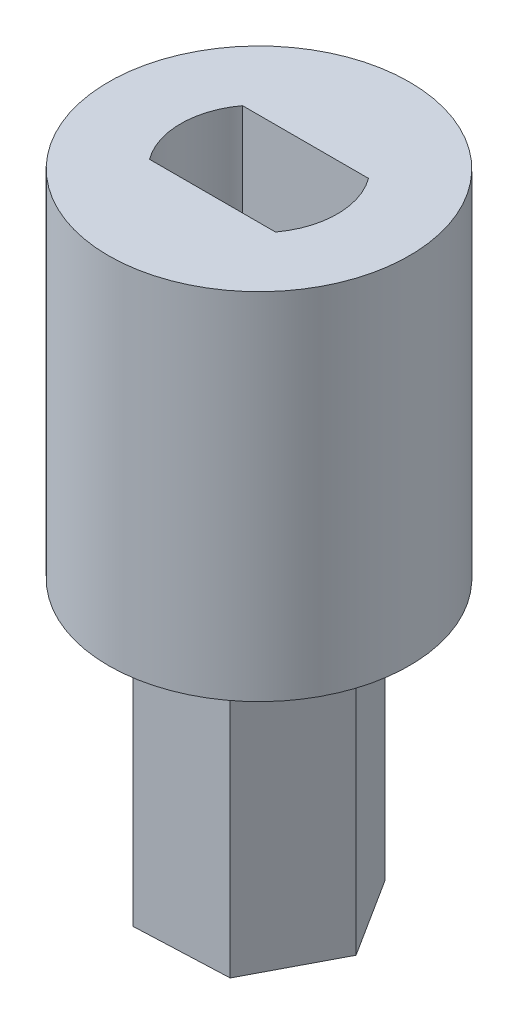
ISO-10303-21;
HEADER;
FILE_DESCRIPTION(('STEP AP214'),'2;1');
FILE_NAME('part.step','',(''),(''),'','','');
FILE_SCHEMA(('AUTOMOTIVE_DESIGN { 1 0 10303 214 1 1 1 1 }'));
ENDSEC;
DATA;
#1=APPLICATION_CONTEXT('core data for automotive mechanical design processes');
#2=APPLICATION_PROTOCOL_DEFINITION('international standard','automotive_design',2000,#1);
#3=PRODUCT_CONTEXT('',#1,'mechanical');
#4=PRODUCT('Part','Part','',(#3));
#5=PRODUCT_RELATED_PRODUCT_CATEGORY('part','',(#4));
#6=PRODUCT_DEFINITION_FORMATION('','',#4);
#7=PRODUCT_DEFINITION_CONTEXT('part definition',#1,'design');
#8=PRODUCT_DEFINITION('design','',#6,#7);
#9=PRODUCT_DEFINITION_SHAPE('','',#8);
#10=(LENGTH_UNIT() NAMED_UNIT(*) SI_UNIT(.MILLI.,.METRE.));
#11=(NAMED_UNIT(*) PLANE_ANGLE_UNIT() SI_UNIT($,.RADIAN.));
#12=(NAMED_UNIT(*) SI_UNIT($,.STERADIAN.) SOLID_ANGLE_UNIT());
#13=UNCERTAINTY_MEASURE_WITH_UNIT(LENGTH_MEASURE(1.E-05),#10,'distance_accuracy_value','');
#14=(GEOMETRIC_REPRESENTATION_CONTEXT(3) GLOBAL_UNCERTAINTY_ASSIGNED_CONTEXT((#13)) GLOBAL_UNIT_ASSIGNED_CONTEXT((#10,
#11,#12)) REPRESENTATION_CONTEXT('',''));
#15=CARTESIAN_POINT('',(0.,0.,0.));
#16=DIRECTION('',(0.,0.,1.));
#17=DIRECTION('',(1.,0.,0.));
#18=AXIS2_PLACEMENT_3D('',#15,#16,#17);
#19=CARTESIAN_POINT('',(-1.76590224374379,11.5,3.37662394493978));
#20=DIRECTION('',(-0.0417255681407558,0.,-0.999129109256322));
#21=DIRECTION('',(-0.999129109256322,0.,0.0417255681407559));
#22=AXIS2_PLACEMENT_3D('',#19,#20,#21);
#23=PLANE('',#22);
#24=DIRECTION('',(0.999129109256322,0.,-0.0417255681407559));
#25=VECTOR('',#24,1.);
#26=CARTESIAN_POINT('',(-1.76590224374379,0.,3.37662394493978));
#27=LINE('',#26,#25);
#28=CARTESIAN_POINT('',(-1.76590224374379,0.,3.37662394493978));
#29=VERTEX_POINT('',#28);
#30=CARTESIAN_POINT('',(2.04129099347278,0.,3.21762817615195));
#31=VERTEX_POINT('',#30);
#32=EDGE_CURVE('E151',#29,#31,#27,.T.);
#33=ORIENTED_EDGE('',*,*,#32,.T.);
#34=DIRECTION('',(0.,-1.,0.));
#35=VECTOR('',#34,1.);
#36=CARTESIAN_POINT('',(2.04129099347278,11.5,3.21762817615195));
#37=LINE('',#36,#35);
#38=CARTESIAN_POINT('',(2.04129099347278,11.5,3.21762817615195));
#39=VERTEX_POINT('',#38);
#40=EDGE_CURVE('E11',#39,#31,#37,.T.);
#41=ORIENTED_EDGE('',*,*,#40,.F.);
#42=DIRECTION('',(0.999129109256322,0.,-0.0417255681407559));
#43=VECTOR('',#42,1.);
#44=CARTESIAN_POINT('',(-1.76590224374379,11.5,3.37662394493978));
#45=LINE('',#44,#43);
#46=CARTESIAN_POINT('',(-1.76590224374379,11.5,3.37662394493978));
#47=VERTEX_POINT('',#46);
#48=EDGE_CURVE('E141',#47,#39,#45,.T.);
#49=ORIENTED_EDGE('',*,*,#48,.F.);
#50=DIRECTION('',(0.,-1.,0.));
#51=VECTOR('',#50,1.);
#52=CARTESIAN_POINT('',(-1.76590224374379,11.5,3.37662394493978));
#53=LINE('',#52,#51);
#54=EDGE_CURVE('E150',#47,#29,#53,.T.);
#55=ORIENTED_EDGE('',*,*,#54,.T.);
#56=EDGE_LOOP('',(#33,#41,#49,#55));
#57=FACE_BOUND('',#56,.T.);
#58=ADVANCED_FACE('F45',(#57),#23,.F.);
#59=CARTESIAN_POINT('',(2.04129099347278,11.5,3.21762817615195));
#60=DIRECTION('',(-0.88613397434687,0.,-0.463429152630928));
#61=DIRECTION('',(-0.463429152630928,0.,0.886133974346871));
#62=AXIS2_PLACEMENT_3D('',#59,#60,#61);
#63=PLANE('',#62);
#64=DIRECTION('',(0.463429152630928,0.,-0.886133974346871));
#65=VECTOR('',#64,1.);
#66=CARTESIAN_POINT('',(2.04129099347278,0.,3.21762817615195));
#67=LINE('',#66,#65);
#68=CARTESIAN_POINT('',(3.80719323721657,0.,-0.158995768787825));
#69=VERTEX_POINT('',#68);
#70=EDGE_CURVE('E155',#31,#69,#67,.T.);
#71=ORIENTED_EDGE('',*,*,#70,.T.);
#72=DIRECTION('',(0.,-1.,0.));
#73=VECTOR('',#72,1.);
#74=CARTESIAN_POINT('',(3.80719323721657,11.5,-0.158995768787825));
#75=LINE('',#74,#73);
#76=CARTESIAN_POINT('',(3.80719323721657,11.5,-0.158995768787825));
#77=VERTEX_POINT('',#76);
#78=EDGE_CURVE('E53',#77,#69,#75,.T.);
#79=ORIENTED_EDGE('',*,*,#78,.F.);
#80=DIRECTION('',(0.463429152630928,0.,-0.886133974346871));
#81=VECTOR('',#80,1.);
#82=CARTESIAN_POINT('',(2.04129099347278,11.5,3.21762817615195));
#83=LINE('',#82,#81);
#84=EDGE_CURVE('E104',#39,#77,#83,.T.);
#85=ORIENTED_EDGE('',*,*,#84,.F.);
#86=ORIENTED_EDGE('',*,*,#40,.T.);
#87=EDGE_LOOP('',(#71,#79,#85,#86));
#88=FACE_BOUND('',#87,.T.);
#89=ADVANCED_FACE('F288',(#88),#63,.F.);
#90=CARTESIAN_POINT('',(3.80719323721657,11.5,-0.158995768787825));
#91=DIRECTION('',(-0.844408406206115,0.,0.535699956625394));
#92=DIRECTION('',(0.535699956625394,0.,0.844408406206115));
#93=AXIS2_PLACEMENT_3D('',#90,#91,#92);
#94=PLANE('',#93);
#95=DIRECTION('',(-0.535699956625394,0.,-0.844408406206115));
#96=VECTOR('',#95,1.);
#97=CARTESIAN_POINT('',(3.80719323721657,0.,-0.158995768787825));
#98=LINE('',#97,#96);
#99=CARTESIAN_POINT('',(1.76590224374379,0.,-3.37662394493978));
#100=VERTEX_POINT('',#99);
#101=EDGE_CURVE('E120',#69,#100,#98,.T.);
#102=ORIENTED_EDGE('',*,*,#101,.T.);
#103=DIRECTION('',(0.,-1.,0.));
#104=VECTOR('',#103,1.);
#105=CARTESIAN_POINT('',(1.76590224374379,11.5,-3.37662394493978));
#106=LINE('',#105,#104);
#107=CARTESIAN_POINT('',(1.76590224374379,11.5,-3.37662394493978));
#108=VERTEX_POINT('',#107);
#109=EDGE_CURVE('E113',#108,#100,#106,.T.);
#110=ORIENTED_EDGE('',*,*,#109,.F.);
#111=DIRECTION('',(-0.535699956625394,0.,-0.844408406206115));
#112=VECTOR('',#111,1.);
#113=CARTESIAN_POINT('',(3.80719323721657,11.5,-0.158995768787825));
#114=LINE('',#113,#112);
#115=EDGE_CURVE('E118',#77,#108,#114,.T.);
#116=ORIENTED_EDGE('',*,*,#115,.F.);
#117=ORIENTED_EDGE('',*,*,#78,.T.);
#118=EDGE_LOOP('',(#102,#110,#116,#117));
#119=FACE_BOUND('',#118,.T.);
#120=ADVANCED_FACE('F115',(#119),#94,.F.);
#121=CARTESIAN_POINT('',(1.76590224374379,11.5,-3.37662394493978));
#122=DIRECTION('',(0.041725568140756,0.,0.999129109256322));
#123=DIRECTION('',(0.999129109256322,0.,-0.041725568140756));
#124=AXIS2_PLACEMENT_3D('',#121,#122,#123);
#125=PLANE('',#124);
#126=DIRECTION('',(-0.999129109256322,0.,0.041725568140756));
#127=VECTOR('',#126,1.);
#128=CARTESIAN_POINT('',(1.76590224374379,0.,-3.37662394493978));
#129=LINE('',#128,#127);
#130=CARTESIAN_POINT('',(-2.04129099347278,0.,-3.21762817615195));
#131=VERTEX_POINT('',#130);
#132=EDGE_CURVE('E161',#100,#131,#129,.T.);
#133=ORIENTED_EDGE('',*,*,#132,.T.);
#134=DIRECTION('',(0.,-1.,0.));
#135=VECTOR('',#134,1.);
#136=CARTESIAN_POINT('',(-2.04129099347278,11.5,-3.21762817615195));
#137=LINE('',#136,#135);
#138=CARTESIAN_POINT('',(-2.04129099347278,11.5,-3.21762817615195));
#139=VERTEX_POINT('',#138);
#140=EDGE_CURVE('E124',#139,#131,#137,.T.);
#141=ORIENTED_EDGE('',*,*,#140,.F.);
#142=DIRECTION('',(-0.999129109256322,0.,0.041725568140756));
#143=VECTOR('',#142,1.);
#144=CARTESIAN_POINT('',(1.76590224374379,11.5,-3.37662394493978));
#145=LINE('',#144,#143);
#146=EDGE_CURVE('E127',#108,#139,#145,.T.);
#147=ORIENTED_EDGE('',*,*,#146,.F.);
#148=ORIENTED_EDGE('',*,*,#109,.T.);
#149=EDGE_LOOP('',(#133,#141,#147,#148));
#150=FACE_BOUND('',#149,.T.);
#151=ADVANCED_FACE('F128',(#150),#125,.F.);
#152=CARTESIAN_POINT('',(-2.04129099347278,11.5,-3.21762817615195));
#153=DIRECTION('',(0.886133974346871,0.,0.463429152630927));
#154=DIRECTION('',(0.463429152630927,0.,-0.886133974346871));
#155=AXIS2_PLACEMENT_3D('',#152,#153,#154);
#156=PLANE('',#155);
#157=DIRECTION('',(-0.463429152630927,0.,0.886133974346871));
#158=VECTOR('',#157,1.);
#159=CARTESIAN_POINT('',(-2.04129099347278,0.,-3.21762817615195));
#160=LINE('',#159,#158);
#161=CARTESIAN_POINT('',(-3.80719323721657,0.,0.158995768787825));
#162=VERTEX_POINT('',#161);
#163=EDGE_CURVE('E164',#131,#162,#160,.T.);
#164=ORIENTED_EDGE('',*,*,#163,.T.);
#165=DIRECTION('',(0.,-1.,0.));
#166=VECTOR('',#165,1.);
#167=CARTESIAN_POINT('',(-3.80719323721657,11.5,0.158995768787825));
#168=LINE('',#167,#166);
#169=CARTESIAN_POINT('',(-3.80719323721657,11.5,0.158995768787825));
#170=VERTEX_POINT('',#169);
#171=EDGE_CURVE('E69',#170,#162,#168,.T.);
#172=ORIENTED_EDGE('',*,*,#171,.F.);
#173=DIRECTION('',(-0.463429152630927,0.,0.886133974346871));
#174=VECTOR('',#173,1.);
#175=CARTESIAN_POINT('',(-2.04129099347278,11.5,-3.21762817615195));
#176=LINE('',#175,#174);
#177=EDGE_CURVE('E133',#139,#170,#176,.T.);
#178=ORIENTED_EDGE('',*,*,#177,.F.);
#179=ORIENTED_EDGE('',*,*,#140,.T.);
#180=EDGE_LOOP('',(#164,#172,#178,#179));
#181=FACE_BOUND('',#180,.T.);
#182=ADVANCED_FACE('F179',(#181),#156,.F.);
#183=CARTESIAN_POINT('',(-3.80719323721657,11.5,0.158995768787825));
#184=DIRECTION('',(0.844408406206115,0.,-0.535699956625394));
#185=DIRECTION('',(-0.535699956625394,0.,-0.844408406206115));
#186=AXIS2_PLACEMENT_3D('',#183,#184,#185);
#187=PLANE('',#186);
#188=DIRECTION('',(0.535699956625394,0.,0.844408406206115));
#189=VECTOR('',#188,1.);
#190=CARTESIAN_POINT('',(-3.80719323721657,0.,0.158995768787825));
#191=LINE('',#190,#189);
#192=EDGE_CURVE('E96',#162,#29,#191,.T.);
#193=ORIENTED_EDGE('',*,*,#192,.T.);
#194=ORIENTED_EDGE('',*,*,#54,.F.);
#195=DIRECTION('',(0.535699956625394,0.,0.844408406206115));
#196=VECTOR('',#195,1.);
#197=CARTESIAN_POINT('',(-3.80719323721657,11.5,0.158995768787825));
#198=LINE('',#197,#196);
#199=EDGE_CURVE('E147',#170,#47,#198,.T.);
#200=ORIENTED_EDGE('',*,*,#199,.F.);
#201=ORIENTED_EDGE('',*,*,#171,.T.);
#202=EDGE_LOOP('',(#193,#194,#200,#201));
#203=FACE_BOUND('',#202,.T.);
#204=ADVANCED_FACE('F182',(#203),#187,.F.);
#205=CARTESIAN_POINT('',(0.,0.,0.));
#206=DIRECTION('',(0.,1.,0.));
#207=DIRECTION('',(0.,0.,1.));
#208=AXIS2_PLACEMENT_3D('',#205,#206,#207);
#209=PLANE('',#208);
#210=CARTESIAN_POINT('',(0.,0.,0.));
#211=DIRECTION('',(0.,-1.,0.));
#212=DIRECTION('',(0.,0.,-1.));
#213=AXIS2_PLACEMENT_3D('',#210,#211,#212);
#214=CIRCLE('',#213,1.25);
#215=CARTESIAN_POINT('',(0.,0.,-1.25));
#216=VERTEX_POINT('',#215);
#217=EDGE_CURVE('E194',#216,#216,#214,.T.);
#218=ORIENTED_EDGE('',*,*,#217,.F.);
#219=EDGE_LOOP('',(#218));
#220=FACE_BOUND('',#219,.T.);
#221=ORIENTED_EDGE('',*,*,#32,.F.);
#222=ORIENTED_EDGE('',*,*,#192,.F.);
#223=ORIENTED_EDGE('',*,*,#163,.F.);
#224=ORIENTED_EDGE('',*,*,#132,.F.);
#225=ORIENTED_EDGE('',*,*,#101,.F.);
#226=ORIENTED_EDGE('',*,*,#70,.F.);
#227=EDGE_LOOP('',(#221,#222,#223,#224,#225,#226));
#228=FACE_BOUND('',#227,.T.);
#229=ADVANCED_FACE('F177',(#220,#228),#209,.F.);
#230=CARTESIAN_POINT('',(0.,11.5,0.));
#231=DIRECTION('',(0.,1.,0.));
#232=DIRECTION('',(0.,0.,1.));
#233=AXIS2_PLACEMENT_3D('',#230,#231,#232);
#234=PLANE('',#233);
#235=CARTESIAN_POINT('',(0.,11.5,0.));
#236=DIRECTION('',(0.,1.,0.));
#237=DIRECTION('',(0.,0.,1.));
#238=AXIS2_PLACEMENT_3D('',#235,#236,#237);
#239=CIRCLE('',#238,6.15);
#240=CARTESIAN_POINT('',(0.,11.5,6.15));
#241=VERTEX_POINT('',#240);
#242=EDGE_CURVE('E186',#241,#241,#239,.T.);
#243=ORIENTED_EDGE('',*,*,#242,.F.);
#244=EDGE_LOOP('',(#243));
#245=FACE_BOUND('',#244,.T.);
#246=ORIENTED_EDGE('',*,*,#199,.T.);
#247=ORIENTED_EDGE('',*,*,#48,.T.);
#248=ORIENTED_EDGE('',*,*,#84,.T.);
#249=ORIENTED_EDGE('',*,*,#115,.T.);
#250=ORIENTED_EDGE('',*,*,#146,.T.);
#251=ORIENTED_EDGE('',*,*,#177,.T.);
#252=EDGE_LOOP('',(#246,#247,#248,#249,#250,#251));
#253=FACE_BOUND('',#252,.T.);
#254=ADVANCED_FACE('F136',(#245,#253),#234,.F.);
#255=CARTESIAN_POINT('',(0.,26.01,0.));
#256=DIRECTION('',(0.,-1.,0.));
#257=DIRECTION('',(0.,0.,-1.));
#258=AXIS2_PLACEMENT_3D('',#255,#256,#257);
#259=CYLINDRICAL_SURFACE('',#258,6.15);
#260=CARTESIAN_POINT('',(0.,26.01,0.));
#261=DIRECTION('',(0.,1.,0.));
#262=DIRECTION('',(0.,0.,1.));
#263=AXIS2_PLACEMENT_3D('',#260,#261,#262);
#264=CIRCLE('',#263,6.15);
#265=CARTESIAN_POINT('',(0.,26.01,6.15));
#266=VERTEX_POINT('',#265);
#267=EDGE_CURVE('E156',#266,#266,#264,.T.);
#268=ORIENTED_EDGE('',*,*,#267,.F.);
#269=EDGE_LOOP('',(#268));
#270=FACE_BOUND('',#269,.T.);
#271=ORIENTED_EDGE('',*,*,#242,.T.);
#272=EDGE_LOOP('',(#271));
#273=FACE_BOUND('',#272,.T.);
#274=ADVANCED_FACE('F306',(#270,#273),#259,.T.);
#275=CARTESIAN_POINT('',(0.,26.01,0.));
#276=DIRECTION('',(0.,1.,0.));
#277=DIRECTION('',(0.,0.,1.));
#278=AXIS2_PLACEMENT_3D('',#275,#276,#277);
#279=PLANE('',#278);
#280=CARTESIAN_POINT('',(0.,26.01,0.));
#281=DIRECTION('',(0.,1.,0.));
#282=DIRECTION('',(0.,0.,1.));
#283=AXIS2_PLACEMENT_3D('',#280,#281,#282);
#284=CIRCLE('',#283,3.2);
#285=CARTESIAN_POINT('',(2.57487863791675,26.01,1.9));
#286=VERTEX_POINT('',#285);
#287=CARTESIAN_POINT('',(2.57487863791675,26.01,-1.9));
#288=VERTEX_POINT('',#287);
#289=EDGE_CURVE('E60',#286,#288,#284,.T.);
#290=ORIENTED_EDGE('',*,*,#289,.F.);
#291=DIRECTION('',(1.,0.,0.));
#292=VECTOR('',#291,1.);
#293=CARTESIAN_POINT('',(-2.57487863791675,26.01,1.9));
#294=LINE('',#293,#292);
#295=CARTESIAN_POINT('',(-2.57487863791675,26.01,1.9));
#296=VERTEX_POINT('',#295);
#297=EDGE_CURVE('E216',#296,#286,#294,.T.);
#298=ORIENTED_EDGE('',*,*,#297,.F.);
#299=CARTESIAN_POINT('',(0.,26.01,0.));
#300=DIRECTION('',(0.,1.,0.));
#301=DIRECTION('',(0.,0.,1.));
#302=AXIS2_PLACEMENT_3D('',#299,#300,#301);
#303=CIRCLE('',#302,3.2);
#304=CARTESIAN_POINT('',(-2.57487863791675,26.01,-1.9));
#305=VERTEX_POINT('',#304);
#306=EDGE_CURVE('E221',#305,#296,#303,.T.);
#307=ORIENTED_EDGE('',*,*,#306,.F.);
#308=DIRECTION('',(-1.,0.,0.));
#309=VECTOR('',#308,1.);
#310=CARTESIAN_POINT('',(-2.57487863791675,26.01,-1.9));
#311=LINE('',#310,#309);
#312=EDGE_CURVE('E225',#288,#305,#311,.T.);
#313=ORIENTED_EDGE('',*,*,#312,.F.);
#314=EDGE_LOOP('',(#290,#298,#307,#313));
#315=FACE_BOUND('',#314,.T.);
#316=ORIENTED_EDGE('',*,*,#267,.T.);
#317=EDGE_LOOP('',(#316));
#318=FACE_BOUND('',#317,.T.);
#319=ADVANCED_FACE('F274',(#315,#318),#279,.T.);
#320=CARTESIAN_POINT('',(0.,8.,0.));
#321=DIRECTION('',(0.,-1.,0.));
#322=DIRECTION('',(0.,0.,-1.));
#323=AXIS2_PLACEMENT_3D('',#320,#321,#322);
#324=CYLINDRICAL_SURFACE('',#323,1.25);
#325=CARTESIAN_POINT('',(0.,8.,0.));
#326=DIRECTION('',(0.,-1.,0.));
#327=DIRECTION('',(0.,0.,-1.));
#328=AXIS2_PLACEMENT_3D('',#325,#326,#327);
#329=CIRCLE('',#328,1.25);
#330=CARTESIAN_POINT('',(0.,8.,-1.25));
#331=VERTEX_POINT('',#330);
#332=EDGE_CURVE('E190',#331,#331,#329,.T.);
#333=ORIENTED_EDGE('',*,*,#332,.F.);
#334=EDGE_LOOP('',(#333));
#335=FACE_BOUND('',#334,.T.);
#336=ORIENTED_EDGE('',*,*,#217,.T.);
#337=EDGE_LOOP('',(#336));
#338=FACE_BOUND('',#337,.T.);
#339=ADVANCED_FACE('F315',(#335,#338),#324,.F.);
#340=CARTESIAN_POINT('',(0.,8.,0.));
#341=DIRECTION('',(0.,-1.,0.));
#342=DIRECTION('',(0.,0.,-1.));
#343=AXIS2_PLACEMENT_3D('',#340,#341,#342);
#344=PLANE('',#343);
#345=ORIENTED_EDGE('',*,*,#332,.T.);
#346=EDGE_LOOP('',(#345));
#347=FACE_BOUND('',#346,.T.);
#348=ADVANCED_FACE('F318',(#347),#344,.T.);
#349=CARTESIAN_POINT('',(0.,18.01,0.));
#350=DIRECTION('',(0.,1.,0.));
#351=DIRECTION('',(0.,0.,1.));
#352=AXIS2_PLACEMENT_3D('',#349,#350,#351);
#353=CYLINDRICAL_SURFACE('',#352,3.2);
#354=ORIENTED_EDGE('',*,*,#289,.T.);
#355=DIRECTION('',(0.,1.,0.));
#356=VECTOR('',#355,1.);
#357=CARTESIAN_POINT('',(2.57487863791675,18.01,-1.9));
#358=LINE('',#357,#356);
#359=CARTESIAN_POINT('',(2.57487863791675,18.01,-1.9));
#360=VERTEX_POINT('',#359);
#361=EDGE_CURVE('E202',#360,#288,#358,.T.);
#362=ORIENTED_EDGE('',*,*,#361,.F.);
#363=CARTESIAN_POINT('',(0.,18.01,0.));
#364=DIRECTION('',(0.,1.,0.));
#365=DIRECTION('',(0.,0.,1.));
#366=AXIS2_PLACEMENT_3D('',#363,#364,#365);
#367=CIRCLE('',#366,3.2);
#368=CARTESIAN_POINT('',(2.57487863791675,18.01,1.9));
#369=VERTEX_POINT('',#368);
#370=EDGE_CURVE('E220',#369,#360,#367,.T.);
#371=ORIENTED_EDGE('',*,*,#370,.F.);
#372=DIRECTION('',(0.,1.,0.));
#373=VECTOR('',#372,1.);
#374=CARTESIAN_POINT('',(2.57487863791675,18.01,1.9));
#375=LINE('',#374,#373);
#376=EDGE_CURVE('E198',#369,#286,#375,.T.);
#377=ORIENTED_EDGE('',*,*,#376,.T.);
#378=EDGE_LOOP('',(#354,#362,#371,#377));
#379=FACE_BOUND('',#378,.T.);
#380=ADVANCED_FACE('F253',(#379),#353,.F.);
#381=CARTESIAN_POINT('',(-2.57487863791675,18.01,1.9));
#382=DIRECTION('',(0.,0.,1.));
#383=DIRECTION('',(1.,0.,0.));
#384=AXIS2_PLACEMENT_3D('',#381,#382,#383);
#385=PLANE('',#384);
#386=ORIENTED_EDGE('',*,*,#297,.T.);
#387=ORIENTED_EDGE('',*,*,#376,.F.);
#388=DIRECTION('',(1.,0.,0.));
#389=VECTOR('',#388,1.);
#390=CARTESIAN_POINT('',(-2.57487863791675,18.01,1.9));
#391=LINE('',#390,#389);
#392=CARTESIAN_POINT('',(-2.57487863791675,18.01,1.9));
#393=VERTEX_POINT('',#392);
#394=EDGE_CURVE('E206',#393,#369,#391,.T.);
#395=ORIENTED_EDGE('',*,*,#394,.F.);
#396=DIRECTION('',(0.,1.,0.));
#397=VECTOR('',#396,1.);
#398=CARTESIAN_POINT('',(-2.57487863791675,18.01,1.9));
#399=LINE('',#398,#397);
#400=EDGE_CURVE('E210',#393,#296,#399,.T.);
#401=ORIENTED_EDGE('',*,*,#400,.T.);
#402=EDGE_LOOP('',(#386,#387,#395,#401));
#403=FACE_BOUND('',#402,.T.);
#404=ADVANCED_FACE('F265',(#403),#385,.F.);
#405=CARTESIAN_POINT('',(0.,18.01,0.));
#406=DIRECTION('',(0.,1.,0.));
#407=DIRECTION('',(0.,0.,1.));
#408=AXIS2_PLACEMENT_3D('',#405,#406,#407);
#409=CYLINDRICAL_SURFACE('',#408,3.2);
#410=ORIENTED_EDGE('',*,*,#306,.T.);
#411=ORIENTED_EDGE('',*,*,#400,.F.);
#412=CARTESIAN_POINT('',(0.,18.01,0.));
#413=DIRECTION('',(0.,1.,0.));
#414=DIRECTION('',(0.,0.,1.));
#415=AXIS2_PLACEMENT_3D('',#412,#413,#414);
#416=CIRCLE('',#415,3.2);
#417=CARTESIAN_POINT('',(-2.57487863791675,18.01,-1.9));
#418=VERTEX_POINT('',#417);
#419=EDGE_CURVE('E234',#418,#393,#416,.T.);
#420=ORIENTED_EDGE('',*,*,#419,.F.);
#421=DIRECTION('',(0.,1.,0.));
#422=VECTOR('',#421,1.);
#423=CARTESIAN_POINT('',(-2.57487863791675,18.01,-1.9));
#424=LINE('',#423,#422);
#425=EDGE_CURVE('E205',#418,#305,#424,.T.);
#426=ORIENTED_EDGE('',*,*,#425,.T.);
#427=EDGE_LOOP('',(#410,#411,#420,#426));
#428=FACE_BOUND('',#427,.T.);
#429=ADVANCED_FACE('F270',(#428),#409,.F.);
#430=CARTESIAN_POINT('',(-2.57487863791675,18.01,-1.9));
#431=DIRECTION('',(0.,0.,-1.));
#432=DIRECTION('',(-1.,0.,0.));
#433=AXIS2_PLACEMENT_3D('',#430,#431,#432);
#434=PLANE('',#433);
#435=ORIENTED_EDGE('',*,*,#312,.T.);
#436=ORIENTED_EDGE('',*,*,#425,.F.);
#437=DIRECTION('',(-1.,0.,0.));
#438=VECTOR('',#437,1.);
#439=CARTESIAN_POINT('',(-2.57487863791675,18.01,-1.9));
#440=LINE('',#439,#438);
#441=EDGE_CURVE('E238',#360,#418,#440,.T.);
#442=ORIENTED_EDGE('',*,*,#441,.F.);
#443=ORIENTED_EDGE('',*,*,#361,.T.);
#444=EDGE_LOOP('',(#435,#436,#442,#443));
#445=FACE_BOUND('',#444,.T.);
#446=ADVANCED_FACE('F277',(#445),#434,.F.);
#447=CARTESIAN_POINT('',(0.,18.01,0.));
#448=DIRECTION('',(0.,1.,0.));
#449=DIRECTION('',(0.,0.,1.));
#450=AXIS2_PLACEMENT_3D('',#447,#448,#449);
#451=PLANE('',#450);
#452=ORIENTED_EDGE('',*,*,#370,.T.);
#453=ORIENTED_EDGE('',*,*,#441,.T.);
#454=ORIENTED_EDGE('',*,*,#419,.T.);
#455=ORIENTED_EDGE('',*,*,#394,.T.);
#456=EDGE_LOOP('',(#452,#453,#454,#455));
#457=FACE_BOUND('',#456,.T.);
#458=ADVANCED_FACE('F247',(#457),#451,.T.);
#459=CLOSED_SHELL('',(#58,#89,#120,#151,#182,#204,#229,#254,#274,#319,#339,#348,#380,#404,#429,
#446,#458));
#460=MANIFOLD_SOLID_BREP('B2',#459);
#461=ADVANCED_BREP_SHAPE_REPRESENTATION('',(#18,#460),#14);
#462=SHAPE_DEFINITION_REPRESENTATION(#9,#461);
ENDSEC;
END-ISO-10303-21;
